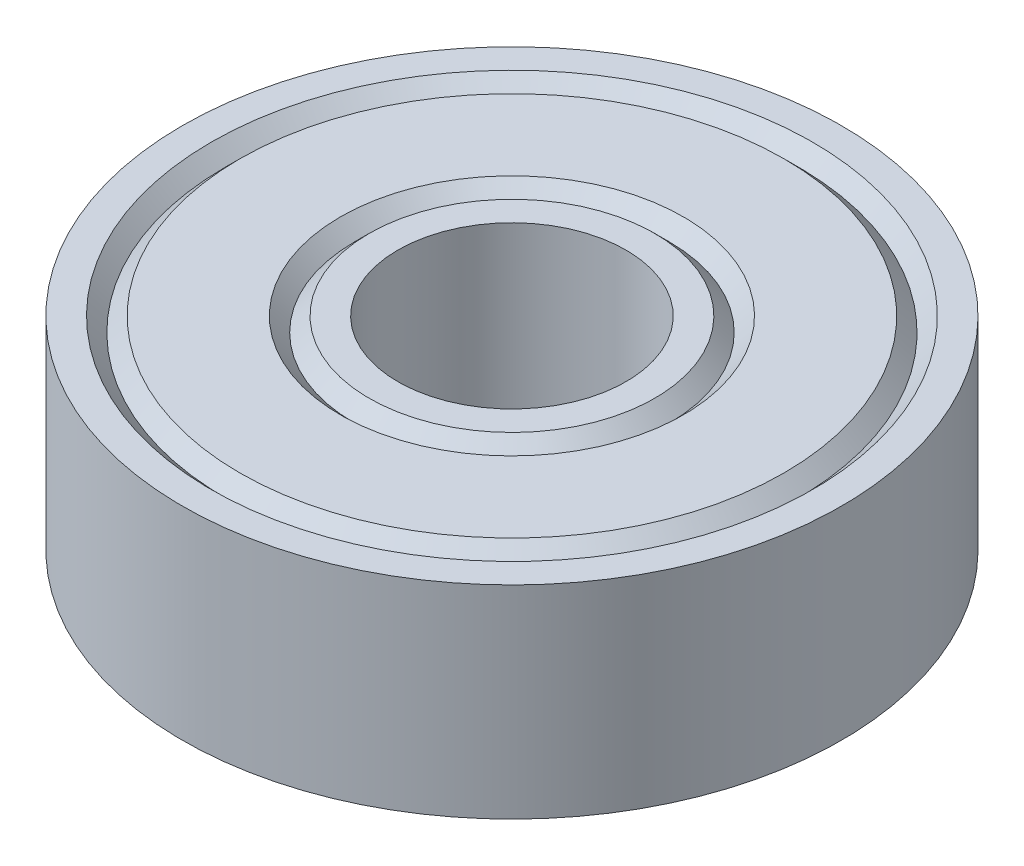
ISO-10303-21;
HEADER;
FILE_DESCRIPTION(('STEP AP214'),'2;1');
FILE_NAME('part.step','',(''),(''),'','','');
FILE_SCHEMA(('AUTOMOTIVE_DESIGN { 1 0 10303 214 1 1 1 1 }'));
ENDSEC;
DATA;
#1=APPLICATION_CONTEXT('core data for automotive mechanical design processes');
#2=APPLICATION_PROTOCOL_DEFINITION('international standard','automotive_design',2000,#1);
#3=PRODUCT_CONTEXT('',#1,'mechanical');
#4=PRODUCT('Part','Part','',(#3));
#5=PRODUCT_RELATED_PRODUCT_CATEGORY('part','',(#4));
#6=PRODUCT_DEFINITION_FORMATION('','',#4);
#7=PRODUCT_DEFINITION_CONTEXT('part definition',#1,'design');
#8=PRODUCT_DEFINITION('design','',#6,#7);
#9=PRODUCT_DEFINITION_SHAPE('','',#8);
#10=(LENGTH_UNIT() NAMED_UNIT(*) SI_UNIT(.MILLI.,.METRE.));
#11=(NAMED_UNIT(*) PLANE_ANGLE_UNIT() SI_UNIT($,.RADIAN.));
#12=(NAMED_UNIT(*) SI_UNIT($,.STERADIAN.) SOLID_ANGLE_UNIT());
#13=UNCERTAINTY_MEASURE_WITH_UNIT(LENGTH_MEASURE(1.E-05),#10,'distance_accuracy_value','');
#14=(GEOMETRIC_REPRESENTATION_CONTEXT(3) GLOBAL_UNCERTAINTY_ASSIGNED_CONTEXT((#13)) GLOBAL_UNIT_ASSIGNED_CONTEXT((#10,
#11,#12)) REPRESENTATION_CONTEXT('',''));
#15=CARTESIAN_POINT('',(0.,0.,0.));
#16=DIRECTION('',(0.,0.,1.));
#17=DIRECTION('',(1.,0.,0.));
#18=AXIS2_PLACEMENT_3D('',#15,#16,#17);
#19=CARTESIAN_POINT('',(0.,4.,0.));
#20=DIRECTION('',(0.,1.,0.));
#21=DIRECTION('',(-1.,0.,0.));
#22=AXIS2_PLACEMENT_3D('',#19,#20,#21);
#23=CYLINDRICAL_SURFACE('',#22,4.5);
#24=CARTESIAN_POINT('',(0.,4.,0.));
#25=DIRECTION('',(0.,1.,0.));
#26=DIRECTION('',(-1.,0.,0.));
#27=AXIS2_PLACEMENT_3D('',#24,#25,#26);
#28=CIRCLE('',#27,4.5);
#29=CARTESIAN_POINT('',(-4.5,4.,0.));
#30=VERTEX_POINT('',#29);
#31=EDGE_CURVE('E83',#30,#30,#28,.T.);
#32=ORIENTED_EDGE('',*,*,#31,.T.);
#33=EDGE_LOOP('',(#32));
#34=FACE_BOUND('',#33,.T.);
#35=CARTESIAN_POINT('',(0.,-4.,0.));
#36=DIRECTION('',(0.,1.,0.));
#37=DIRECTION('',(-1.,0.,0.));
#38=AXIS2_PLACEMENT_3D('',#35,#36,#37);
#39=CIRCLE('',#38,4.5);
#40=CARTESIAN_POINT('',(-4.5,-4.,0.));
#41=VERTEX_POINT('',#40);
#42=EDGE_CURVE('E10',#41,#41,#39,.T.);
#43=ORIENTED_EDGE('',*,*,#42,.F.);
#44=EDGE_LOOP('',(#43));
#45=FACE_BOUND('',#44,.T.);
#46=ADVANCED_FACE('F31',(#34,#45),#23,.F.);
#47=CARTESIAN_POINT('',(-4.5,-4.,0.));
#48=DIRECTION('',(0.,-1.,0.));
#49=DIRECTION('',(1.,0.,0.));
#50=AXIS2_PLACEMENT_3D('',#47,#48,#49);
#51=PLANE('',#50);
#52=ORIENTED_EDGE('',*,*,#42,.T.);
#53=EDGE_LOOP('',(#52));
#54=FACE_BOUND('',#53,.T.);
#55=CARTESIAN_POINT('',(0.,-4.,0.));
#56=DIRECTION('',(0.,1.,0.));
#57=DIRECTION('',(-1.,0.,0.));
#58=AXIS2_PLACEMENT_3D('',#55,#56,#57);
#59=CIRCLE('',#58,5.63333333333333);
#60=CARTESIAN_POINT('',(-5.63333333333333,-4.,0.));
#61=VERTEX_POINT('',#60);
#62=EDGE_CURVE('E37',#61,#61,#59,.T.);
#63=ORIENTED_EDGE('',*,*,#62,.F.);
#64=EDGE_LOOP('',(#63));
#65=FACE_BOUND('',#64,.T.);
#66=ADVANCED_FACE('F101',(#54,#65),#51,.T.);
#67=CARTESIAN_POINT('',(0.,-3.43333333333333,0.));
#68=DIRECTION('',(0.,1.,0.));
#69=DIRECTION('',(-1.,0.,0.));
#70=AXIS2_PLACEMENT_3D('',#67,#68,#69);
#71=CONICAL_SURFACE('',#70,6.2,0.785398163397452);
#72=ORIENTED_EDGE('',*,*,#62,.T.);
#73=EDGE_LOOP('',(#72));
#74=FACE_BOUND('',#73,.T.);
#75=CARTESIAN_POINT('',(0.,-3.43333333333333,0.));
#76=DIRECTION('',(0.,1.,0.));
#77=DIRECTION('',(-1.,0.,0.));
#78=AXIS2_PLACEMENT_3D('',#75,#76,#77);
#79=CIRCLE('',#78,6.2);
#80=CARTESIAN_POINT('',(-6.2,-3.43333333333333,0.));
#81=VERTEX_POINT('',#80);
#82=EDGE_CURVE('E41',#81,#81,#79,.T.);
#83=ORIENTED_EDGE('',*,*,#82,.F.);
#84=EDGE_LOOP('',(#83));
#85=FACE_BOUND('',#84,.T.);
#86=ADVANCED_FACE('F105',(#74,#85),#71,.T.);
#87=CARTESIAN_POINT('',(0.,-4.,0.));
#88=DIRECTION('',(0.,-1.,0.));
#89=DIRECTION('',(1.,0.,0.));
#90=AXIS2_PLACEMENT_3D('',#87,#88,#89);
#91=CONICAL_SURFACE('',#90,6.76666666666666,0.785398163397448);
#92=ORIENTED_EDGE('',*,*,#82,.T.);
#93=EDGE_LOOP('',(#92));
#94=FACE_BOUND('',#93,.T.);
#95=CARTESIAN_POINT('',(0.,-4.,0.));
#96=DIRECTION('',(0.,1.,0.));
#97=DIRECTION('',(-1.,0.,0.));
#98=AXIS2_PLACEMENT_3D('',#95,#96,#97);
#99=CIRCLE('',#98,6.76666666666666);
#100=CARTESIAN_POINT('',(-6.76666666666666,-4.,0.));
#101=VERTEX_POINT('',#100);
#102=EDGE_CURVE('E45',#101,#101,#99,.T.);
#103=ORIENTED_EDGE('',*,*,#102,.F.);
#104=EDGE_LOOP('',(#103));
#105=FACE_BOUND('',#104,.T.);
#106=ADVANCED_FACE('F109',(#94,#105),#91,.F.);
#107=CARTESIAN_POINT('',(-6.76666666666666,-4.,0.));
#108=DIRECTION('',(0.,-1.,0.));
#109=DIRECTION('',(1.,0.,0.));
#110=AXIS2_PLACEMENT_3D('',#107,#108,#109);
#111=PLANE('',#110);
#112=ORIENTED_EDGE('',*,*,#102,.T.);
#113=EDGE_LOOP('',(#112));
#114=FACE_BOUND('',#113,.T.);
#115=CARTESIAN_POINT('',(0.,-4.,0.));
#116=DIRECTION('',(0.,1.,0.));
#117=DIRECTION('',(-1.,0.,0.));
#118=AXIS2_PLACEMENT_3D('',#115,#116,#117);
#119=CIRCLE('',#118,10.7333333333333);
#120=CARTESIAN_POINT('',(-10.7333333333333,-4.,0.));
#121=VERTEX_POINT('',#120);
#122=EDGE_CURVE('E50',#121,#121,#119,.T.);
#123=ORIENTED_EDGE('',*,*,#122,.F.);
#124=EDGE_LOOP('',(#123));
#125=FACE_BOUND('',#124,.T.);
#126=ADVANCED_FACE('F115',(#114,#125),#111,.T.);
#127=CARTESIAN_POINT('',(0.,-3.43333333333333,0.));
#128=DIRECTION('',(0.,1.,0.));
#129=DIRECTION('',(-1.,0.,0.));
#130=AXIS2_PLACEMENT_3D('',#127,#128,#129);
#131=CONICAL_SURFACE('',#130,11.3,0.785398163397446);
#132=ORIENTED_EDGE('',*,*,#122,.T.);
#133=EDGE_LOOP('',(#132));
#134=FACE_BOUND('',#133,.T.);
#135=CARTESIAN_POINT('',(0.,-3.43333333333333,0.));
#136=DIRECTION('',(0.,1.,0.));
#137=DIRECTION('',(-1.,0.,0.));
#138=AXIS2_PLACEMENT_3D('',#135,#136,#137);
#139=CIRCLE('',#138,11.3);
#140=CARTESIAN_POINT('',(-11.3,-3.43333333333333,0.));
#141=VERTEX_POINT('',#140);
#142=EDGE_CURVE('E53',#141,#141,#139,.T.);
#143=ORIENTED_EDGE('',*,*,#142,.F.);
#144=EDGE_LOOP('',(#143));
#145=FACE_BOUND('',#144,.T.);
#146=ADVANCED_FACE('F119',(#134,#145),#131,.T.);
#147=CARTESIAN_POINT('',(0.,-4.,0.));
#148=DIRECTION('',(0.,-1.,0.));
#149=DIRECTION('',(1.,0.,0.));
#150=AXIS2_PLACEMENT_3D('',#147,#148,#149);
#151=CONICAL_SURFACE('',#150,11.8666666666667,0.785398163397446);
#152=ORIENTED_EDGE('',*,*,#142,.T.);
#153=EDGE_LOOP('',(#152));
#154=FACE_BOUND('',#153,.T.);
#155=CARTESIAN_POINT('',(0.,-4.,0.));
#156=DIRECTION('',(0.,1.,0.));
#157=DIRECTION('',(-1.,0.,0.));
#158=AXIS2_PLACEMENT_3D('',#155,#156,#157);
#159=CIRCLE('',#158,11.8666666666667);
#160=CARTESIAN_POINT('',(-11.8666666666667,-4.,0.));
#161=VERTEX_POINT('',#160);
#162=EDGE_CURVE('E56',#161,#161,#159,.T.);
#163=ORIENTED_EDGE('',*,*,#162,.F.);
#164=EDGE_LOOP('',(#163));
#165=FACE_BOUND('',#164,.T.);
#166=ADVANCED_FACE('F123',(#154,#165),#151,.F.);
#167=CARTESIAN_POINT('',(-11.8666666666667,-4.,0.));
#168=DIRECTION('',(0.,-1.,0.));
#169=DIRECTION('',(1.,0.,0.));
#170=AXIS2_PLACEMENT_3D('',#167,#168,#169);
#171=PLANE('',#170);
#172=ORIENTED_EDGE('',*,*,#162,.T.);
#173=EDGE_LOOP('',(#172));
#174=FACE_BOUND('',#173,.T.);
#175=CARTESIAN_POINT('',(0.,-4.,0.));
#176=DIRECTION('',(0.,1.,0.));
#177=DIRECTION('',(-1.,0.,0.));
#178=AXIS2_PLACEMENT_3D('',#175,#176,#177);
#179=CIRCLE('',#178,13.);
#180=CARTESIAN_POINT('',(-13.,-4.,0.));
#181=VERTEX_POINT('',#180);
#182=EDGE_CURVE('E59',#181,#181,#179,.T.);
#183=ORIENTED_EDGE('',*,*,#182,.F.);
#184=EDGE_LOOP('',(#183));
#185=FACE_BOUND('',#184,.T.);
#186=ADVANCED_FACE('F127',(#174,#185),#171,.T.);
#187=CARTESIAN_POINT('',(0.,4.,0.));
#188=DIRECTION('',(0.,1.,0.));
#189=DIRECTION('',(-1.,0.,0.));
#190=AXIS2_PLACEMENT_3D('',#187,#188,#189);
#191=CYLINDRICAL_SURFACE('',#190,13.);
#192=ORIENTED_EDGE('',*,*,#182,.T.);
#193=EDGE_LOOP('',(#192));
#194=FACE_BOUND('',#193,.T.);
#195=CARTESIAN_POINT('',(0.,4.,0.));
#196=DIRECTION('',(0.,1.,0.));
#197=DIRECTION('',(-1.,0.,0.));
#198=AXIS2_PLACEMENT_3D('',#195,#196,#197);
#199=CIRCLE('',#198,13.);
#200=CARTESIAN_POINT('',(-13.,4.,0.));
#201=VERTEX_POINT('',#200);
#202=EDGE_CURVE('E62',#201,#201,#199,.T.);
#203=ORIENTED_EDGE('',*,*,#202,.F.);
#204=EDGE_LOOP('',(#203));
#205=FACE_BOUND('',#204,.T.);
#206=ADVANCED_FACE('F131',(#194,#205),#191,.T.);
#207=CARTESIAN_POINT('',(-11.8666666666667,4.,0.));
#208=DIRECTION('',(0.,1.,0.));
#209=DIRECTION('',(-1.,0.,0.));
#210=AXIS2_PLACEMENT_3D('',#207,#208,#209);
#211=PLANE('',#210);
#212=ORIENTED_EDGE('',*,*,#202,.T.);
#213=EDGE_LOOP('',(#212));
#214=FACE_BOUND('',#213,.T.);
#215=CARTESIAN_POINT('',(0.,4.,0.));
#216=DIRECTION('',(0.,1.,0.));
#217=DIRECTION('',(-1.,0.,0.));
#218=AXIS2_PLACEMENT_3D('',#215,#216,#217);
#219=CIRCLE('',#218,11.8666666666667);
#220=CARTESIAN_POINT('',(-11.8666666666667,4.,0.));
#221=VERTEX_POINT('',#220);
#222=EDGE_CURVE('E65',#221,#221,#219,.T.);
#223=ORIENTED_EDGE('',*,*,#222,.F.);
#224=EDGE_LOOP('',(#223));
#225=FACE_BOUND('',#224,.T.);
#226=ADVANCED_FACE('F135',(#214,#225),#211,.T.);
#227=CARTESIAN_POINT('',(0.,3.43333333333333,0.));
#228=DIRECTION('',(0.,1.,0.));
#229=DIRECTION('',(-1.,0.,0.));
#230=AXIS2_PLACEMENT_3D('',#227,#228,#229);
#231=CONICAL_SURFACE('',#230,11.3,0.785398163397449);
#232=ORIENTED_EDGE('',*,*,#222,.T.);
#233=EDGE_LOOP('',(#232));
#234=FACE_BOUND('',#233,.T.);
#235=CARTESIAN_POINT('',(0.,3.43333333333333,0.));
#236=DIRECTION('',(0.,1.,0.));
#237=DIRECTION('',(-1.,0.,0.));
#238=AXIS2_PLACEMENT_3D('',#235,#236,#237);
#239=CIRCLE('',#238,11.3);
#240=CARTESIAN_POINT('',(-11.3,3.43333333333333,0.));
#241=VERTEX_POINT('',#240);
#242=EDGE_CURVE('E68',#241,#241,#239,.T.);
#243=ORIENTED_EDGE('',*,*,#242,.F.);
#244=EDGE_LOOP('',(#243));
#245=FACE_BOUND('',#244,.T.);
#246=ADVANCED_FACE('F139',(#234,#245),#231,.F.);
#247=CARTESIAN_POINT('',(0.,4.,0.));
#248=DIRECTION('',(0.,-1.,0.));
#249=DIRECTION('',(1.,0.,0.));
#250=AXIS2_PLACEMENT_3D('',#247,#248,#249);
#251=CONICAL_SURFACE('',#250,10.7333333333333,0.785398163397447);
#252=ORIENTED_EDGE('',*,*,#242,.T.);
#253=EDGE_LOOP('',(#252));
#254=FACE_BOUND('',#253,.T.);
#255=CARTESIAN_POINT('',(0.,4.,0.));
#256=DIRECTION('',(0.,1.,0.));
#257=DIRECTION('',(-1.,0.,0.));
#258=AXIS2_PLACEMENT_3D('',#255,#256,#257);
#259=CIRCLE('',#258,10.7333333333333);
#260=CARTESIAN_POINT('',(-10.7333333333333,4.,0.));
#261=VERTEX_POINT('',#260);
#262=EDGE_CURVE('E71',#261,#261,#259,.T.);
#263=ORIENTED_EDGE('',*,*,#262,.F.);
#264=EDGE_LOOP('',(#263));
#265=FACE_BOUND('',#264,.T.);
#266=ADVANCED_FACE('F143',(#254,#265),#251,.T.);
#267=CARTESIAN_POINT('',(-6.76666666666666,4.,0.));
#268=DIRECTION('',(0.,1.,0.));
#269=DIRECTION('',(-1.,0.,0.));
#270=AXIS2_PLACEMENT_3D('',#267,#268,#269);
#271=PLANE('',#270);
#272=ORIENTED_EDGE('',*,*,#262,.T.);
#273=EDGE_LOOP('',(#272));
#274=FACE_BOUND('',#273,.T.);
#275=CARTESIAN_POINT('',(0.,4.,0.));
#276=DIRECTION('',(0.,1.,0.));
#277=DIRECTION('',(-1.,0.,0.));
#278=AXIS2_PLACEMENT_3D('',#275,#276,#277);
#279=CIRCLE('',#278,6.76666666666666);
#280=CARTESIAN_POINT('',(-6.76666666666666,4.,0.));
#281=VERTEX_POINT('',#280);
#282=EDGE_CURVE('E74',#281,#281,#279,.T.);
#283=ORIENTED_EDGE('',*,*,#282,.F.);
#284=EDGE_LOOP('',(#283));
#285=FACE_BOUND('',#284,.T.);
#286=ADVANCED_FACE('F147',(#274,#285),#271,.T.);
#287=CARTESIAN_POINT('',(0.,3.43333333333333,0.));
#288=DIRECTION('',(0.,1.,0.));
#289=DIRECTION('',(-1.,0.,0.));
#290=AXIS2_PLACEMENT_3D('',#287,#288,#289);
#291=CONICAL_SURFACE('',#290,6.2,0.785398163397448);
#292=ORIENTED_EDGE('',*,*,#282,.T.);
#293=EDGE_LOOP('',(#292));
#294=FACE_BOUND('',#293,.T.);
#295=CARTESIAN_POINT('',(0.,3.43333333333333,0.));
#296=DIRECTION('',(0.,1.,0.));
#297=DIRECTION('',(-1.,0.,0.));
#298=AXIS2_PLACEMENT_3D('',#295,#296,#297);
#299=CIRCLE('',#298,6.2);
#300=CARTESIAN_POINT('',(-6.2,3.43333333333333,0.));
#301=VERTEX_POINT('',#300);
#302=EDGE_CURVE('E77',#301,#301,#299,.T.);
#303=ORIENTED_EDGE('',*,*,#302,.F.);
#304=EDGE_LOOP('',(#303));
#305=FACE_BOUND('',#304,.T.);
#306=ADVANCED_FACE('F97',(#294,#305),#291,.F.);
#307=CARTESIAN_POINT('',(0.,4.,0.));
#308=DIRECTION('',(0.,-1.,0.));
#309=DIRECTION('',(1.,0.,0.));
#310=AXIS2_PLACEMENT_3D('',#307,#308,#309);
#311=CONICAL_SURFACE('',#310,5.63333333333333,0.785398163397449);
#312=ORIENTED_EDGE('',*,*,#302,.T.);
#313=EDGE_LOOP('',(#312));
#314=FACE_BOUND('',#313,.T.);
#315=CARTESIAN_POINT('',(0.,4.,0.));
#316=DIRECTION('',(0.,1.,0.));
#317=DIRECTION('',(-1.,0.,0.));
#318=AXIS2_PLACEMENT_3D('',#315,#316,#317);
#319=CIRCLE('',#318,5.63333333333333);
#320=CARTESIAN_POINT('',(-5.63333333333333,4.,0.));
#321=VERTEX_POINT('',#320);
#322=EDGE_CURVE('E80',#321,#321,#319,.T.);
#323=ORIENTED_EDGE('',*,*,#322,.F.);
#324=EDGE_LOOP('',(#323));
#325=FACE_BOUND('',#324,.T.);
#326=ADVANCED_FACE('F91',(#314,#325),#311,.T.);
#327=CARTESIAN_POINT('',(-4.5,4.,0.));
#328=DIRECTION('',(0.,1.,0.));
#329=DIRECTION('',(-1.,0.,0.));
#330=AXIS2_PLACEMENT_3D('',#327,#328,#329);
#331=PLANE('',#330);
#332=ORIENTED_EDGE('',*,*,#322,.T.);
#333=EDGE_LOOP('',(#332));
#334=FACE_BOUND('',#333,.T.);
#335=ORIENTED_EDGE('',*,*,#31,.F.);
#336=EDGE_LOOP('',(#335));
#337=FACE_BOUND('',#336,.T.);
#338=ADVANCED_FACE('F89',(#334,#337),#331,.T.);
#339=CLOSED_SHELL('',(#46,#66,#86,#106,#126,#146,#166,#186,#206,#226,#246,#266,#286,#306,#326,#338));
#340=MANIFOLD_SOLID_BREP('B2',#339);
#341=ADVANCED_BREP_SHAPE_REPRESENTATION('',(#18,#340),#14);
#342=SHAPE_DEFINITION_REPRESENTATION(#9,#341);
ENDSEC;
END-ISO-10303-21;
